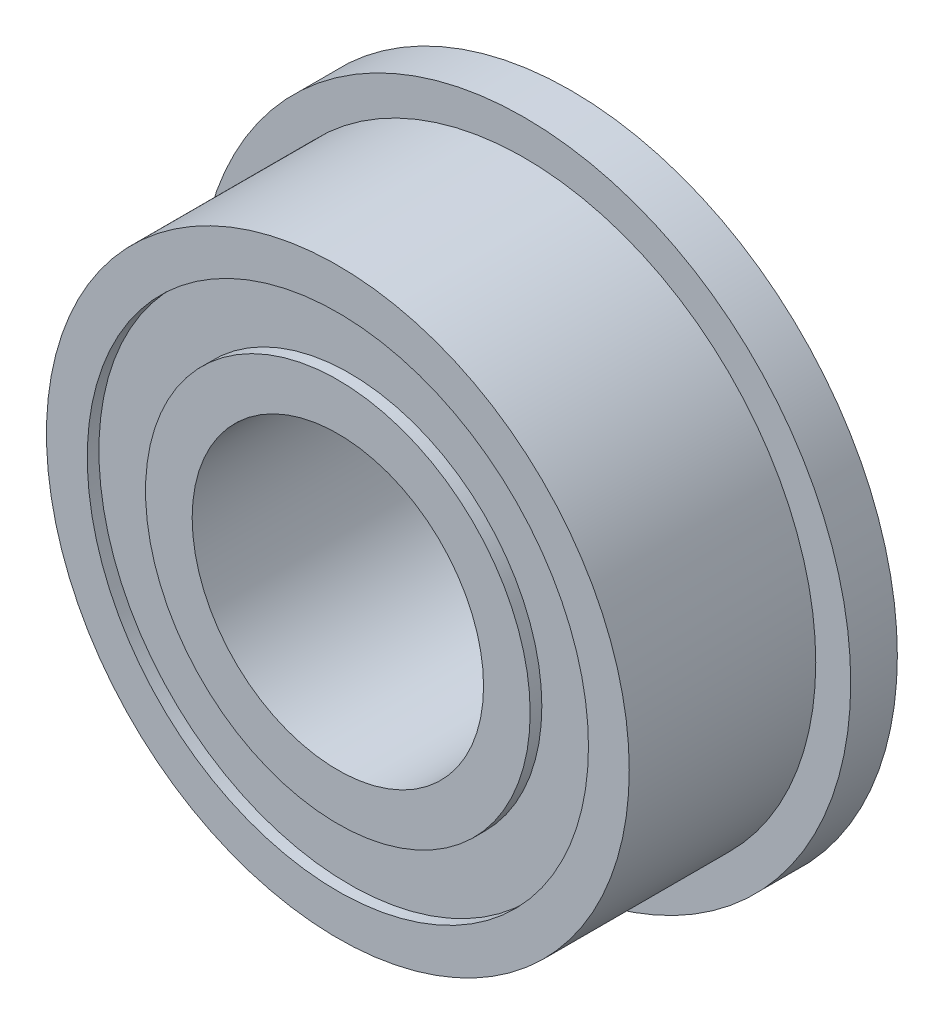
ISO-10303-21;
HEADER;
FILE_DESCRIPTION(('STEP AP214'),'2;1');
FILE_NAME('part.step','',(''),(''),'','','');
FILE_SCHEMA(('AUTOMOTIVE_DESIGN { 1 0 10303 214 1 1 1 1 }'));
ENDSEC;
DATA;
#1=APPLICATION_CONTEXT('core data for automotive mechanical design processes');
#2=APPLICATION_PROTOCOL_DEFINITION('international standard','automotive_design',2000,#1);
#3=PRODUCT_CONTEXT('',#1,'mechanical');
#4=PRODUCT('Part','Part','',(#3));
#5=PRODUCT_RELATED_PRODUCT_CATEGORY('part','',(#4));
#6=PRODUCT_DEFINITION_FORMATION('','',#4);
#7=PRODUCT_DEFINITION_CONTEXT('part definition',#1,'design');
#8=PRODUCT_DEFINITION('design','',#6,#7);
#9=PRODUCT_DEFINITION_SHAPE('','',#8);
#10=(LENGTH_UNIT() NAMED_UNIT(*) SI_UNIT(.MILLI.,.METRE.));
#11=(NAMED_UNIT(*) PLANE_ANGLE_UNIT() SI_UNIT($,.RADIAN.));
#12=(NAMED_UNIT(*) SI_UNIT($,.STERADIAN.) SOLID_ANGLE_UNIT());
#13=UNCERTAINTY_MEASURE_WITH_UNIT(LENGTH_MEASURE(1.E-05),#10,'distance_accuracy_value','');
#14=(GEOMETRIC_REPRESENTATION_CONTEXT(3) GLOBAL_UNCERTAINTY_ASSIGNED_CONTEXT((#13)) GLOBAL_UNIT_ASSIGNED_CONTEXT((#10,
#11,#12)) REPRESENTATION_CONTEXT('',''));
#15=CARTESIAN_POINT('',(0.,0.,0.));
#16=DIRECTION('',(0.,0.,1.));
#17=DIRECTION('',(1.,0.,0.));
#18=AXIS2_PLACEMENT_3D('',#15,#16,#17);
#19=CARTESIAN_POINT('',(0.,0.,0.8));
#20=DIRECTION('',(0.,0.,1.));
#21=DIRECTION('',(1.,0.,0.));
#22=AXIS2_PLACEMENT_3D('',#19,#20,#21);
#23=PLANE('',#22);
#24=CARTESIAN_POINT('',(0.,0.,0.8));
#25=DIRECTION('',(0.,0.,1.));
#26=DIRECTION('',(1.,0.,0.));
#27=AXIS2_PLACEMENT_3D('',#24,#25,#26);
#28=CIRCLE('',#27,5.);
#29=CARTESIAN_POINT('',(5.,0.,0.8));
#30=VERTEX_POINT('',#29);
#31=EDGE_CURVE('E50',#30,#30,#28,.T.);
#32=ORIENTED_EDGE('',*,*,#31,.F.);
#33=EDGE_LOOP('',(#32));
#34=FACE_BOUND('',#33,.T.);
#35=CARTESIAN_POINT('',(0.,0.,0.8));
#36=DIRECTION('',(0.,0.,1.));
#37=DIRECTION('',(1.,0.,0.));
#38=AXIS2_PLACEMENT_3D('',#35,#36,#37);
#39=CIRCLE('',#38,5.6);
#40=CARTESIAN_POINT('',(5.6,0.,0.8));
#41=VERTEX_POINT('',#40);
#42=EDGE_CURVE('E54',#41,#41,#39,.T.);
#43=ORIENTED_EDGE('',*,*,#42,.T.);
#44=EDGE_LOOP('',(#43));
#45=FACE_BOUND('',#44,.T.);
#46=ADVANCED_FACE('F38',(#34,#45),#23,.T.);
#47=CARTESIAN_POINT('',(0.,0.,0.));
#48=DIRECTION('',(0.,0.,1.));
#49=DIRECTION('',(1.,0.,0.));
#50=AXIS2_PLACEMENT_3D('',#47,#48,#49);
#51=PLANE('',#50);
#52=CARTESIAN_POINT('',(0.,0.,0.));
#53=DIRECTION('',(0.,0.,1.));
#54=DIRECTION('',(1.,0.,0.));
#55=AXIS2_PLACEMENT_3D('',#52,#53,#54);
#56=CIRCLE('',#55,5.6);
#57=CARTESIAN_POINT('',(5.6,0.,0.));
#58=VERTEX_POINT('',#57);
#59=EDGE_CURVE('E57',#58,#58,#56,.T.);
#60=ORIENTED_EDGE('',*,*,#59,.F.);
#61=EDGE_LOOP('',(#60));
#62=FACE_BOUND('',#61,.T.);
#63=CARTESIAN_POINT('',(0.,0.,0.));
#64=DIRECTION('',(0.,0.,1.));
#65=DIRECTION('',(1.,0.,0.));
#66=AXIS2_PLACEMENT_3D('',#63,#64,#65);
#67=CIRCLE('',#66,2.5);
#68=CARTESIAN_POINT('',(2.5,0.,0.));
#69=VERTEX_POINT('',#68);
#70=EDGE_CURVE('E78',#69,#69,#67,.T.);
#71=ORIENTED_EDGE('',*,*,#70,.T.);
#72=EDGE_LOOP('',(#71));
#73=FACE_BOUND('',#72,.T.);
#74=ADVANCED_FACE('F106',(#62,#73),#51,.F.);
#75=CARTESIAN_POINT('',(0.,0.,0.8));
#76=DIRECTION('',(0.,0.,-1.));
#77=DIRECTION('',(-1.,0.,0.));
#78=AXIS2_PLACEMENT_3D('',#75,#76,#77);
#79=CYLINDRICAL_SURFACE('',#78,5.6);
#80=ORIENTED_EDGE('',*,*,#42,.F.);
#81=EDGE_LOOP('',(#80));
#82=FACE_BOUND('',#81,.T.);
#83=ORIENTED_EDGE('',*,*,#59,.T.);
#84=EDGE_LOOP('',(#83));
#85=FACE_BOUND('',#84,.T.);
#86=ADVANCED_FACE('F40',(#82,#85),#79,.T.);
#87=CARTESIAN_POINT('',(0.,0.,4.));
#88=DIRECTION('',(0.,0.,1.));
#89=DIRECTION('',(1.,0.,0.));
#90=AXIS2_PLACEMENT_3D('',#87,#88,#89);
#91=PLANE('',#90);
#92=CARTESIAN_POINT('',(0.,0.,4.));
#93=DIRECTION('',(0.,0.,1.));
#94=DIRECTION('',(1.,0.,0.));
#95=AXIS2_PLACEMENT_3D('',#92,#93,#94);
#96=CIRCLE('',#95,5.);
#97=CARTESIAN_POINT('',(5.,0.,4.));
#98=VERTEX_POINT('',#97);
#99=EDGE_CURVE('E64',#98,#98,#96,.T.);
#100=ORIENTED_EDGE('',*,*,#99,.T.);
#101=EDGE_LOOP('',(#100));
#102=FACE_BOUND('',#101,.T.);
#103=CARTESIAN_POINT('',(0.,0.,4.));
#104=DIRECTION('',(0.,0.,1.));
#105=DIRECTION('',(1.,0.,0.));
#106=AXIS2_PLACEMENT_3D('',#103,#104,#105);
#107=CIRCLE('',#106,4.3);
#108=CARTESIAN_POINT('',(4.3,0.,4.));
#109=VERTEX_POINT('',#108);
#110=EDGE_CURVE('E68',#109,#109,#107,.T.);
#111=ORIENTED_EDGE('',*,*,#110,.F.);
#112=EDGE_LOOP('',(#111));
#113=FACE_BOUND('',#112,.T.);
#114=ADVANCED_FACE('F148',(#102,#113),#91,.T.);
#115=CARTESIAN_POINT('',(0.,0.,4.));
#116=DIRECTION('',(0.,0.,-1.));
#117=DIRECTION('',(-1.,0.,0.));
#118=AXIS2_PLACEMENT_3D('',#115,#116,#117);
#119=CYLINDRICAL_SURFACE('',#118,5.);
#120=ORIENTED_EDGE('',*,*,#99,.F.);
#121=EDGE_LOOP('',(#120));
#122=FACE_BOUND('',#121,.T.);
#123=ORIENTED_EDGE('',*,*,#31,.T.);
#124=EDGE_LOOP('',(#123));
#125=FACE_BOUND('',#124,.T.);
#126=ADVANCED_FACE('F146',(#122,#125),#119,.T.);
#127=CARTESIAN_POINT('',(0.,0.,4.));
#128=DIRECTION('',(0.,0.,-1.));
#129=DIRECTION('',(-1.,0.,0.));
#130=AXIS2_PLACEMENT_3D('',#127,#128,#129);
#131=CYLINDRICAL_SURFACE('',#130,4.3);
#132=CARTESIAN_POINT('',(0.,0.,3.8));
#133=DIRECTION('',(0.,0.,1.));
#134=DIRECTION('',(1.,0.,0.));
#135=AXIS2_PLACEMENT_3D('',#132,#133,#134);
#136=CIRCLE('',#135,4.3);
#137=CARTESIAN_POINT('',(4.3,0.,3.8));
#138=VERTEX_POINT('',#137);
#139=EDGE_CURVE('E10',#138,#138,#136,.T.);
#140=ORIENTED_EDGE('',*,*,#139,.F.);
#141=EDGE_LOOP('',(#140));
#142=FACE_BOUND('',#141,.T.);
#143=ORIENTED_EDGE('',*,*,#110,.T.);
#144=EDGE_LOOP('',(#143));
#145=FACE_BOUND('',#144,.T.);
#146=ADVANCED_FACE('F133',(#142,#145),#131,.F.);
#147=CARTESIAN_POINT('',(0.,0.,4.));
#148=DIRECTION('',(0.,0.,1.));
#149=DIRECTION('',(1.,0.,0.));
#150=AXIS2_PLACEMENT_3D('',#147,#148,#149);
#151=PLANE('',#150);
#152=CARTESIAN_POINT('',(0.,0.,4.));
#153=DIRECTION('',(0.,0.,1.));
#154=DIRECTION('',(1.,0.,0.));
#155=AXIS2_PLACEMENT_3D('',#152,#153,#154);
#156=CIRCLE('',#155,3.3);
#157=CARTESIAN_POINT('',(3.3,0.,4.));
#158=VERTEX_POINT('',#157);
#159=EDGE_CURVE('E72',#158,#158,#156,.T.);
#160=ORIENTED_EDGE('',*,*,#159,.T.);
#161=EDGE_LOOP('',(#160));
#162=FACE_BOUND('',#161,.T.);
#163=CARTESIAN_POINT('',(0.,0.,4.));
#164=DIRECTION('',(0.,0.,1.));
#165=DIRECTION('',(1.,0.,0.));
#166=AXIS2_PLACEMENT_3D('',#163,#164,#165);
#167=CIRCLE('',#166,2.5);
#168=CARTESIAN_POINT('',(2.5,0.,4.));
#169=VERTEX_POINT('',#168);
#170=EDGE_CURVE('E77',#169,#169,#167,.T.);
#171=ORIENTED_EDGE('',*,*,#170,.F.);
#172=EDGE_LOOP('',(#171));
#173=FACE_BOUND('',#172,.T.);
#174=ADVANCED_FACE('F141',(#162,#173),#151,.T.);
#175=CARTESIAN_POINT('',(0.,0.,4.));
#176=DIRECTION('',(0.,0.,-1.));
#177=DIRECTION('',(-1.,0.,0.));
#178=AXIS2_PLACEMENT_3D('',#175,#176,#177);
#179=CYLINDRICAL_SURFACE('',#178,3.3);
#180=CARTESIAN_POINT('',(0.,0.,3.8));
#181=DIRECTION('',(0.,0.,1.));
#182=DIRECTION('',(1.,0.,0.));
#183=AXIS2_PLACEMENT_3D('',#180,#181,#182);
#184=CIRCLE('',#183,3.3);
#185=CARTESIAN_POINT('',(3.3,0.,3.8));
#186=VERTEX_POINT('',#185);
#187=EDGE_CURVE('E86',#186,#186,#184,.T.);
#188=ORIENTED_EDGE('',*,*,#187,.T.);
#189=EDGE_LOOP('',(#188));
#190=FACE_BOUND('',#189,.T.);
#191=ORIENTED_EDGE('',*,*,#159,.F.);
#192=EDGE_LOOP('',(#191));
#193=FACE_BOUND('',#192,.T.);
#194=ADVANCED_FACE('F90',(#190,#193),#179,.T.);
#195=CARTESIAN_POINT('',(0.,0.,4.));
#196=DIRECTION('',(0.,0.,-1.));
#197=DIRECTION('',(-1.,0.,0.));
#198=AXIS2_PLACEMENT_3D('',#195,#196,#197);
#199=CYLINDRICAL_SURFACE('',#198,2.5);
#200=ORIENTED_EDGE('',*,*,#170,.T.);
#201=EDGE_LOOP('',(#200));
#202=FACE_BOUND('',#201,.T.);
#203=ORIENTED_EDGE('',*,*,#70,.F.);
#204=EDGE_LOOP('',(#203));
#205=FACE_BOUND('',#204,.T.);
#206=ADVANCED_FACE('F95',(#202,#205),#199,.F.);
#207=CARTESIAN_POINT('',(0.,0.,3.8));
#208=DIRECTION('',(0.,0.,1.));
#209=DIRECTION('',(1.,0.,0.));
#210=AXIS2_PLACEMENT_3D('',#207,#208,#209);
#211=PLANE('',#210);
#212=ORIENTED_EDGE('',*,*,#139,.T.);
#213=EDGE_LOOP('',(#212));
#214=FACE_BOUND('',#213,.T.);
#215=ORIENTED_EDGE('',*,*,#187,.F.);
#216=EDGE_LOOP('',(#215));
#217=FACE_BOUND('',#216,.T.);
#218=ADVANCED_FACE('F93',(#214,#217),#211,.T.);
#219=CLOSED_SHELL('',(#46,#74,#86,#114,#126,#146,#174,#194,#206,#218));
#220=CARTESIAN_POINT('',(0.,0.,1.));
#221=DIRECTION('',(0.,0.,1.));
#222=DIRECTION('',(1.,0.,0.));
#223=AXIS2_PLACEMENT_3D('',#220,#221,#222);
#224=PLANE('',#223);
#225=CARTESIAN_POINT('',(0.,0.,1.));
#226=DIRECTION('',(0.,0.,1.));
#227=DIRECTION('',(1.,0.,0.));
#228=AXIS2_PLACEMENT_3D('',#225,#226,#227);
#229=CIRCLE('',#228,4.3);
#230=CARTESIAN_POINT('',(4.3,0.,1.));
#231=VERTEX_POINT('',#230);
#232=EDGE_CURVE('E81',#231,#231,#229,.T.);
#233=ORIENTED_EDGE('',*,*,#232,.F.);
#234=EDGE_LOOP('',(#233));
#235=FACE_BOUND('',#234,.T.);
#236=CARTESIAN_POINT('',(0.,0.,1.));
#237=DIRECTION('',(0.,0.,1.));
#238=DIRECTION('',(1.,0.,0.));
#239=AXIS2_PLACEMENT_3D('',#236,#237,#238);
#240=CIRCLE('',#239,3.3);
#241=CARTESIAN_POINT('',(3.3,0.,1.));
#242=VERTEX_POINT('',#241);
#243=EDGE_CURVE('E46',#242,#242,#240,.T.);
#244=ORIENTED_EDGE('',*,*,#243,.T.);
#245=EDGE_LOOP('',(#244));
#246=FACE_BOUND('',#245,.T.);
#247=ADVANCED_FACE('F130',(#235,#246),#224,.F.);
#248=CARTESIAN_POINT('',(0.,0.,0.8));
#249=DIRECTION('',(0.,0.,1.));
#250=DIRECTION('',(1.,0.,0.));
#251=AXIS2_PLACEMENT_3D('',#248,#249,#250);
#252=CIRCLE('',#251,4.3);
#253=CARTESIAN_POINT('',(4.3,0.,0.8));
#254=VERTEX_POINT('',#253);
#255=EDGE_CURVE('E69',#254,#254,#252,.T.);
#256=ORIENTED_EDGE('',*,*,#255,.F.);
#257=EDGE_LOOP('',(#256));
#258=FACE_BOUND('',#257,.T.);
#259=ORIENTED_EDGE('',*,*,#232,.T.);
#260=EDGE_LOOP('',(#259));
#261=FACE_BOUND('',#260,.T.);
#262=ADVANCED_FACE('F120',(#258,#261),#131,.F.);
#263=CARTESIAN_POINT('',(0.,0.,0.8));
#264=DIRECTION('',(0.,0.,1.));
#265=DIRECTION('',(1.,0.,0.));
#266=AXIS2_PLACEMENT_3D('',#263,#264,#265);
#267=CIRCLE('',#266,3.3);
#268=CARTESIAN_POINT('',(3.3,0.,0.8));
#269=VERTEX_POINT('',#268);
#270=EDGE_CURVE('E60',#269,#269,#267,.T.);
#271=ORIENTED_EDGE('',*,*,#270,.F.);
#272=EDGE_LOOP('',(#271));
#273=FACE_BOUND('',#272,.T.);
#274=ORIENTED_EDGE('',*,*,#255,.T.);
#275=EDGE_LOOP('',(#274));
#276=FACE_BOUND('',#275,.T.);
#277=ADVANCED_FACE('F109',(#273,#276),#23,.T.);
#278=ORIENTED_EDGE('',*,*,#270,.T.);
#279=EDGE_LOOP('',(#278));
#280=FACE_BOUND('',#279,.T.);
#281=ORIENTED_EDGE('',*,*,#243,.F.);
#282=EDGE_LOOP('',(#281));
#283=FACE_BOUND('',#282,.T.);
#284=ADVANCED_FACE('F119',(#280,#283),#179,.T.);
#285=CLOSED_SHELL('',(#247,#262,#277,#284));
#286=ORIENTED_CLOSED_SHELL('',*,#285,.T.);
#287=BREP_WITH_VOIDS('B2',#219,(#286));
#288=ADVANCED_BREP_SHAPE_REPRESENTATION('',(#18,#287),#14);
#289=SHAPE_DEFINITION_REPRESENTATION(#9,#288);
ENDSEC;
END-ISO-10303-21;
